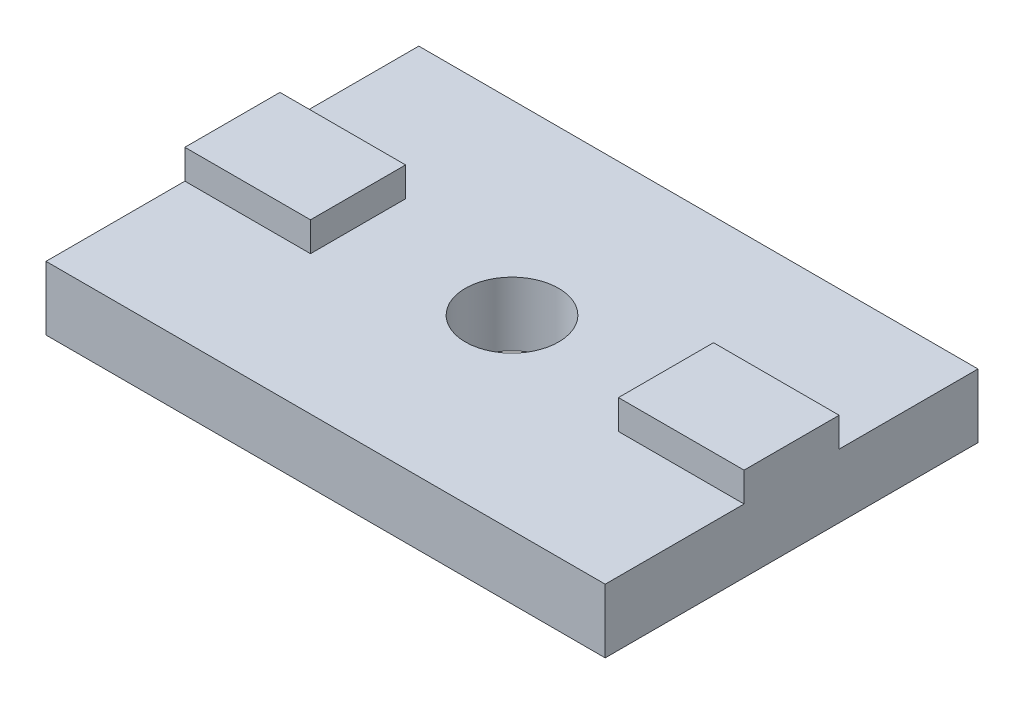
ISO-10303-21;
HEADER;
FILE_DESCRIPTION(('STEP AP214'),'2;1');
FILE_NAME('part.step','',(''),(''),'','','');
FILE_SCHEMA(('AUTOMOTIVE_DESIGN { 1 0 10303 214 1 1 1 1 }'));
ENDSEC;
DATA;
#1=APPLICATION_CONTEXT('core data for automotive mechanical design processes');
#2=APPLICATION_PROTOCOL_DEFINITION('international standard','automotive_design',2000,#1);
#3=PRODUCT_CONTEXT('',#1,'mechanical');
#4=PRODUCT('Part','Part','',(#3));
#5=PRODUCT_RELATED_PRODUCT_CATEGORY('part','',(#4));
#6=PRODUCT_DEFINITION_FORMATION('','',#4);
#7=PRODUCT_DEFINITION_CONTEXT('part definition',#1,'design');
#8=PRODUCT_DEFINITION('design','',#6,#7);
#9=PRODUCT_DEFINITION_SHAPE('','',#8);
#10=(LENGTH_UNIT() NAMED_UNIT(*) SI_UNIT(.MILLI.,.METRE.));
#11=(NAMED_UNIT(*) PLANE_ANGLE_UNIT() SI_UNIT($,.RADIAN.));
#12=(NAMED_UNIT(*) SI_UNIT($,.STERADIAN.) SOLID_ANGLE_UNIT());
#13=UNCERTAINTY_MEASURE_WITH_UNIT(LENGTH_MEASURE(1.E-05),#10,'distance_accuracy_value','');
#14=(GEOMETRIC_REPRESENTATION_CONTEXT(3) GLOBAL_UNCERTAINTY_ASSIGNED_CONTEXT((#13)) GLOBAL_UNIT_ASSIGNED_CONTEXT((#10,
#11,#12)) REPRESENTATION_CONTEXT('',''));
#15=CARTESIAN_POINT('',(0.,0.,0.));
#16=DIRECTION('',(0.,0.,1.));
#17=DIRECTION('',(1.,0.,0.));
#18=AXIS2_PLACEMENT_3D('',#15,#16,#17);
#19=CARTESIAN_POINT('',(0.,4.35,0.));
#20=DIRECTION('',(0.,-1.,0.));
#21=DIRECTION('',(0.,0.,-1.));
#22=AXIS2_PLACEMENT_3D('',#19,#20,#21);
#23=PLANE('',#22);
#24=CARTESIAN_POINT('',(16.1721162783775,4.35,-18.9316286390001));
#25=DIRECTION('',(0.,1.,0.));
#26=DIRECTION('',(0.,0.,1.));
#27=AXIS2_PLACEMENT_3D('',#24,#25,#26);
#28=CIRCLE('',#27,3.175);
#29=CARTESIAN_POINT('',(16.1721162783775,4.35,-15.7566286390001));
#30=VERTEX_POINT('',#29);
#31=EDGE_CURVE('E179',#30,#30,#28,.T.);
#32=ORIENTED_EDGE('',*,*,#31,.F.);
#33=EDGE_LOOP('',(#32));
#34=FACE_BOUND('',#33,.T.);
#35=DIRECTION('',(-1.,0.,0.));
#36=VECTOR('',#35,1.);
#37=CARTESIAN_POINT('',(26.6623162783775,4.35,-22.1700855208305));
#38=LINE('',#37,#36);
#39=CARTESIAN_POINT('',(35.2221162783775,4.35,-22.1700855208305));
#40=VERTEX_POINT('',#39);
#41=CARTESIAN_POINT('',(26.6623162783775,4.35,-22.1700855208305));
#42=VERTEX_POINT('',#41);
#43=EDGE_CURVE('E142',#40,#42,#38,.T.);
#44=ORIENTED_EDGE('',*,*,#43,.F.);
#45=DIRECTION('',(0.,0.,-1.));
#46=VECTOR('',#45,1.);
#47=CARTESIAN_POINT('',(35.2221162783775,4.35,-6.23162863900006));
#48=LINE('',#47,#46);
#49=CARTESIAN_POINT('',(35.2221162783775,4.35,-31.6316286390001));
#50=VERTEX_POINT('',#49);
#51=EDGE_CURVE('E190',#40,#50,#48,.T.);
#52=ORIENTED_EDGE('',*,*,#51,.T.);
#53=DIRECTION('',(-1.,0.,0.));
#54=VECTOR('',#53,1.);
#55=CARTESIAN_POINT('',(-2.87788372162251,4.35,-31.6316286390001));
#56=LINE('',#55,#54);
#57=CARTESIAN_POINT('',(-2.87788372162251,4.35,-31.6316286390001));
#58=VERTEX_POINT('',#57);
#59=EDGE_CURVE('E193',#50,#58,#56,.T.);
#60=ORIENTED_EDGE('',*,*,#59,.T.);
#61=DIRECTION('',(0.,0.,1.));
#62=VECTOR('',#61,1.);
#63=CARTESIAN_POINT('',(-2.87788372162251,4.35,-6.23162863900006));
#64=LINE('',#63,#62);
#65=CARTESIAN_POINT('',(-2.87788372162251,4.35,-22.1700855208305));
#66=VERTEX_POINT('',#65);
#67=EDGE_CURVE('E185',#58,#66,#64,.T.);
#68=ORIENTED_EDGE('',*,*,#67,.T.);
#69=DIRECTION('',(-1.,0.,0.));
#70=VECTOR('',#69,1.);
#71=CARTESIAN_POINT('',(5.6819162783775,4.35,-22.1700855208305));
#72=LINE('',#71,#70);
#73=CARTESIAN_POINT('',(5.6819162783775,4.35,-22.1700855208305));
#74=VERTEX_POINT('',#73);
#75=EDGE_CURVE('E146',#74,#66,#72,.T.);
#76=ORIENTED_EDGE('',*,*,#75,.F.);
#77=DIRECTION('',(0.,0.,-1.));
#78=VECTOR('',#77,1.);
#79=CARTESIAN_POINT('',(5.6819162783775,4.35,-22.1700855208305));
#80=LINE('',#79,#78);
#81=CARTESIAN_POINT('',(5.6819162783775,4.35,-15.6931717571696));
#82=VERTEX_POINT('',#81);
#83=EDGE_CURVE('E143',#82,#74,#80,.T.);
#84=ORIENTED_EDGE('',*,*,#83,.F.);
#85=DIRECTION('',(1.,0.,0.));
#86=VECTOR('',#85,1.);
#87=CARTESIAN_POINT('',(5.6819162783775,4.35,-15.6931717571696));
#88=LINE('',#87,#86);
#89=CARTESIAN_POINT('',(-2.87788372162251,4.35,-15.6931717571696));
#90=VERTEX_POINT('',#89);
#91=EDGE_CURVE('E156',#90,#82,#88,.T.);
#92=ORIENTED_EDGE('',*,*,#91,.F.);
#93=CARTESIAN_POINT('',(-2.87788372162251,4.35,-6.23162863900006));
#94=VERTEX_POINT('',#93);
#95=EDGE_CURVE('E188',#90,#94,#64,.T.);
#96=ORIENTED_EDGE('',*,*,#95,.T.);
#97=DIRECTION('',(1.,0.,0.));
#98=VECTOR('',#97,1.);
#99=CARTESIAN_POINT('',(-2.87788372162251,4.35,-6.23162863900006));
#100=LINE('',#99,#98);
#101=CARTESIAN_POINT('',(35.2221162783775,4.35,-6.23162863900006));
#102=VERTEX_POINT('',#101);
#103=EDGE_CURVE('E187',#94,#102,#100,.T.);
#104=ORIENTED_EDGE('',*,*,#103,.T.);
#105=CARTESIAN_POINT('',(35.2221162783775,4.35,-15.6931717571696));
#106=VERTEX_POINT('',#105);
#107=EDGE_CURVE('E191',#102,#106,#48,.T.);
#108=ORIENTED_EDGE('',*,*,#107,.T.);
#109=DIRECTION('',(1.,0.,0.));
#110=VECTOR('',#109,1.);
#111=CARTESIAN_POINT('',(26.6623162783775,4.35,-15.6931717571696));
#112=LINE('',#111,#110);
#113=CARTESIAN_POINT('',(26.6623162783775,4.35,-15.6931717571696));
#114=VERTEX_POINT('',#113);
#115=EDGE_CURVE('E53',#114,#106,#112,.T.);
#116=ORIENTED_EDGE('',*,*,#115,.F.);
#117=DIRECTION('',(0.,0.,1.));
#118=VECTOR('',#117,1.);
#119=CARTESIAN_POINT('',(26.6623162783775,4.35,-22.1700855208305));
#120=LINE('',#119,#118);
#121=EDGE_CURVE('E48',#42,#114,#120,.T.);
#122=ORIENTED_EDGE('',*,*,#121,.F.);
#123=EDGE_LOOP('',(#44,#52,#60,#68,#76,#84,#92,#96,#104,#108,#116,#122));
#124=FACE_BOUND('',#123,.T.);
#125=ADVANCED_FACE('F33',(#34,#124),#23,.F.);
#126=CARTESIAN_POINT('',(0.,0.,0.));
#127=DIRECTION('',(0.,-1.,0.));
#128=DIRECTION('',(0.,0.,-1.));
#129=AXIS2_PLACEMENT_3D('',#126,#127,#128);
#130=PLANE('',#129);
#131=DIRECTION('',(0.,0.,1.));
#132=VECTOR('',#131,1.);
#133=CARTESIAN_POINT('',(-2.87788372162251,0.,-6.23162863900006));
#134=LINE('',#133,#132);
#135=CARTESIAN_POINT('',(-2.87788372162251,0.,-31.6316286390001));
#136=VERTEX_POINT('',#135);
#137=CARTESIAN_POINT('',(-2.87788372162251,0.,-6.23162863900006));
#138=VERTEX_POINT('',#137);
#139=EDGE_CURVE('E182',#136,#138,#134,.T.);
#140=ORIENTED_EDGE('',*,*,#139,.F.);
#141=DIRECTION('',(-1.,0.,0.));
#142=VECTOR('',#141,1.);
#143=CARTESIAN_POINT('',(-2.87788372162251,0.,-31.6316286390001));
#144=LINE('',#143,#142);
#145=CARTESIAN_POINT('',(35.2221162783775,0.,-31.6316286390001));
#146=VERTEX_POINT('',#145);
#147=EDGE_CURVE('E202',#146,#136,#144,.T.);
#148=ORIENTED_EDGE('',*,*,#147,.F.);
#149=DIRECTION('',(0.,0.,-1.));
#150=VECTOR('',#149,1.);
#151=CARTESIAN_POINT('',(35.2221162783775,0.,-6.23162863900006));
#152=LINE('',#151,#150);
#153=CARTESIAN_POINT('',(35.2221162783775,0.,-6.23162863900006));
#154=VERTEX_POINT('',#153);
#155=EDGE_CURVE('E200',#154,#146,#152,.T.);
#156=ORIENTED_EDGE('',*,*,#155,.F.);
#157=DIRECTION('',(1.,0.,0.));
#158=VECTOR('',#157,1.);
#159=CARTESIAN_POINT('',(-2.87788372162251,0.,-6.23162863900006));
#160=LINE('',#159,#158);
#161=EDGE_CURVE('E198',#138,#154,#160,.T.);
#162=ORIENTED_EDGE('',*,*,#161,.F.);
#163=EDGE_LOOP('',(#140,#148,#156,#162));
#164=FACE_BOUND('',#163,.T.);
#165=CARTESIAN_POINT('',(16.1721162783775,0.,-18.9316286390001));
#166=DIRECTION('',(0.,1.,0.));
#167=DIRECTION('',(0.,0.,1.));
#168=AXIS2_PLACEMENT_3D('',#165,#166,#167);
#169=CIRCLE('',#168,3.175);
#170=CARTESIAN_POINT('',(16.1721162783775,0.,-15.7566286390001));
#171=VERTEX_POINT('',#170);
#172=EDGE_CURVE('E178',#171,#171,#169,.T.);
#173=ORIENTED_EDGE('',*,*,#172,.T.);
#174=EDGE_LOOP('',(#173));
#175=FACE_BOUND('',#174,.T.);
#176=ADVANCED_FACE('F221',(#164,#175),#130,.T.);
#177=CARTESIAN_POINT('',(-2.87788372162251,4.35,-6.23162863900006));
#178=DIRECTION('',(1.,0.,0.));
#179=DIRECTION('',(0.,0.,-1.));
#180=AXIS2_PLACEMENT_3D('',#177,#178,#179);
#181=PLANE('',#180);
#182=ORIENTED_EDGE('',*,*,#139,.T.);
#183=DIRECTION('',(0.,-1.,0.));
#184=VECTOR('',#183,1.);
#185=CARTESIAN_POINT('',(-2.87788372162251,4.35,-6.23162863900006));
#186=LINE('',#185,#184);
#187=EDGE_CURVE('E11',#94,#138,#186,.T.);
#188=ORIENTED_EDGE('',*,*,#187,.F.);
#189=ORIENTED_EDGE('',*,*,#95,.F.);
#190=DIRECTION('',(0.,-1.,0.));
#191=VECTOR('',#190,1.);
#192=CARTESIAN_POINT('',(-2.87788372162251,6.35,-15.6931717571696));
#193=LINE('',#192,#191);
#194=CARTESIAN_POINT('',(-2.87788372162251,6.35,-15.6931717571696));
#195=VERTEX_POINT('',#194);
#196=EDGE_CURVE('E169',#195,#90,#193,.T.);
#197=ORIENTED_EDGE('',*,*,#196,.F.);
#198=DIRECTION('',(0.,0.,1.));
#199=VECTOR('',#198,1.);
#200=CARTESIAN_POINT('',(-2.87788372162251,6.35,-22.1700855208305));
#201=LINE('',#200,#199);
#202=CARTESIAN_POINT('',(-2.87788372162251,6.35,-22.1700855208305));
#203=VERTEX_POINT('',#202);
#204=EDGE_CURVE('E158',#203,#195,#201,.T.);
#205=ORIENTED_EDGE('',*,*,#204,.F.);
#206=DIRECTION('',(0.,-1.,0.));
#207=VECTOR('',#206,1.);
#208=CARTESIAN_POINT('',(-2.87788372162251,6.35,-22.1700855208305));
#209=LINE('',#208,#207);
#210=EDGE_CURVE('E172',#203,#66,#209,.T.);
#211=ORIENTED_EDGE('',*,*,#210,.T.);
#212=ORIENTED_EDGE('',*,*,#67,.F.);
#213=DIRECTION('',(0.,-1.,0.));
#214=VECTOR('',#213,1.);
#215=CARTESIAN_POINT('',(-2.87788372162251,4.35,-31.6316286390001));
#216=LINE('',#215,#214);
#217=EDGE_CURVE('E195',#58,#136,#216,.T.);
#218=ORIENTED_EDGE('',*,*,#217,.T.);
#219=EDGE_LOOP('',(#182,#188,#189,#197,#205,#211,#212,#218));
#220=FACE_BOUND('',#219,.T.);
#221=ADVANCED_FACE('F35',(#220),#181,.F.);
#222=CARTESIAN_POINT('',(-2.87788372162251,4.35,-6.23162863900006));
#223=DIRECTION('',(0.,0.,-1.));
#224=DIRECTION('',(-1.,0.,0.));
#225=AXIS2_PLACEMENT_3D('',#222,#223,#224);
#226=PLANE('',#225);
#227=ORIENTED_EDGE('',*,*,#161,.T.);
#228=DIRECTION('',(0.,-1.,0.));
#229=VECTOR('',#228,1.);
#230=CARTESIAN_POINT('',(35.2221162783775,4.35,-6.23162863900006));
#231=LINE('',#230,#229);
#232=EDGE_CURVE('E41',#102,#154,#231,.T.);
#233=ORIENTED_EDGE('',*,*,#232,.F.);
#234=ORIENTED_EDGE('',*,*,#103,.F.);
#235=ORIENTED_EDGE('',*,*,#187,.T.);
#236=EDGE_LOOP('',(#227,#233,#234,#235));
#237=FACE_BOUND('',#236,.T.);
#238=ADVANCED_FACE('F244',(#237),#226,.F.);
#239=CARTESIAN_POINT('',(35.2221162783775,4.35,-6.23162863900006));
#240=DIRECTION('',(-1.,0.,0.));
#241=DIRECTION('',(0.,0.,1.));
#242=AXIS2_PLACEMENT_3D('',#239,#240,#241);
#243=PLANE('',#242);
#244=ORIENTED_EDGE('',*,*,#155,.T.);
#245=DIRECTION('',(0.,-1.,0.));
#246=VECTOR('',#245,1.);
#247=CARTESIAN_POINT('',(35.2221162783775,4.35,-31.6316286390001));
#248=LINE('',#247,#246);
#249=EDGE_CURVE('E206',#50,#146,#248,.T.);
#250=ORIENTED_EDGE('',*,*,#249,.F.);
#251=ORIENTED_EDGE('',*,*,#51,.F.);
#252=DIRECTION('',(0.,-1.,0.));
#253=VECTOR('',#252,1.);
#254=CARTESIAN_POINT('',(35.2221162783775,6.35,-22.1700855208305));
#255=LINE('',#254,#253);
#256=CARTESIAN_POINT('',(35.2221162783775,6.35,-22.1700855208305));
#257=VERTEX_POINT('',#256);
#258=EDGE_CURVE('E381',#257,#40,#255,.T.);
#259=ORIENTED_EDGE('',*,*,#258,.F.);
#260=DIRECTION('',(0.,0.,-1.));
#261=VECTOR('',#260,1.);
#262=CARTESIAN_POINT('',(35.2221162783775,6.35,-22.1700855208305));
#263=LINE('',#262,#261);
#264=CARTESIAN_POINT('',(35.2221162783775,6.35,-15.6931717571696));
#265=VERTEX_POINT('',#264);
#266=EDGE_CURVE('E136',#265,#257,#263,.T.);
#267=ORIENTED_EDGE('',*,*,#266,.F.);
#268=DIRECTION('',(0.,-1.,0.));
#269=VECTOR('',#268,1.);
#270=CARTESIAN_POINT('',(35.2221162783775,6.35,-15.6931717571696));
#271=LINE('',#270,#269);
#272=EDGE_CURVE('E148',#265,#106,#271,.T.);
#273=ORIENTED_EDGE('',*,*,#272,.T.);
#274=ORIENTED_EDGE('',*,*,#107,.F.);
#275=ORIENTED_EDGE('',*,*,#232,.T.);
#276=EDGE_LOOP('',(#244,#250,#251,#259,#267,#273,#274,#275));
#277=FACE_BOUND('',#276,.T.);
#278=ADVANCED_FACE('F213',(#277),#243,.F.);
#279=CARTESIAN_POINT('',(-2.87788372162251,4.35,-31.6316286390001));
#280=DIRECTION('',(0.,0.,1.));
#281=DIRECTION('',(1.,0.,0.));
#282=AXIS2_PLACEMENT_3D('',#279,#280,#281);
#283=PLANE('',#282);
#284=ORIENTED_EDGE('',*,*,#147,.T.);
#285=ORIENTED_EDGE('',*,*,#217,.F.);
#286=ORIENTED_EDGE('',*,*,#59,.F.);
#287=ORIENTED_EDGE('',*,*,#249,.T.);
#288=EDGE_LOOP('',(#284,#285,#286,#287));
#289=FACE_BOUND('',#288,.T.);
#290=ADVANCED_FACE('F225',(#289),#283,.F.);
#291=CARTESIAN_POINT('',(16.1721162783775,4.35,-18.9316286390001));
#292=DIRECTION('',(0.,-1.,0.));
#293=DIRECTION('',(0.,0.,-1.));
#294=AXIS2_PLACEMENT_3D('',#291,#292,#293);
#295=CYLINDRICAL_SURFACE('',#294,3.175);
#296=ORIENTED_EDGE('',*,*,#31,.T.);
#297=EDGE_LOOP('',(#296));
#298=FACE_BOUND('',#297,.T.);
#299=ORIENTED_EDGE('',*,*,#172,.F.);
#300=EDGE_LOOP('',(#299));
#301=FACE_BOUND('',#300,.T.);
#302=ADVANCED_FACE('F260',(#298,#301),#295,.F.);
#303=CARTESIAN_POINT('',(5.6819162783775,6.35,-22.1700855208305));
#304=DIRECTION('',(-1.,0.,0.));
#305=DIRECTION('',(0.,0.,1.));
#306=AXIS2_PLACEMENT_3D('',#303,#304,#305);
#307=PLANE('',#306);
#308=ORIENTED_EDGE('',*,*,#83,.T.);
#309=DIRECTION('',(0.,-1.,0.));
#310=VECTOR('',#309,1.);
#311=CARTESIAN_POINT('',(5.6819162783775,6.35,-22.1700855208305));
#312=LINE('',#311,#310);
#313=CARTESIAN_POINT('',(5.6819162783775,6.35,-22.1700855208305));
#314=VERTEX_POINT('',#313);
#315=EDGE_CURVE('E175',#314,#74,#312,.T.);
#316=ORIENTED_EDGE('',*,*,#315,.F.);
#317=DIRECTION('',(0.,0.,-1.));
#318=VECTOR('',#317,1.);
#319=CARTESIAN_POINT('',(5.6819162783775,6.35,-22.1700855208305));
#320=LINE('',#319,#318);
#321=CARTESIAN_POINT('',(5.6819162783775,6.35,-15.6931717571696));
#322=VERTEX_POINT('',#321);
#323=EDGE_CURVE('E152',#322,#314,#320,.T.);
#324=ORIENTED_EDGE('',*,*,#323,.F.);
#325=DIRECTION('',(0.,-1.,0.));
#326=VECTOR('',#325,1.);
#327=CARTESIAN_POINT('',(5.6819162783775,6.35,-15.6931717571696));
#328=LINE('',#327,#326);
#329=EDGE_CURVE('E161',#322,#82,#328,.T.);
#330=ORIENTED_EDGE('',*,*,#329,.T.);
#331=EDGE_LOOP('',(#308,#316,#324,#330));
#332=FACE_BOUND('',#331,.T.);
#333=ADVANCED_FACE('F237',(#332),#307,.F.);
#334=CARTESIAN_POINT('',(5.6819162783775,6.35,-22.1700855208305));
#335=DIRECTION('',(0.,0.,1.));
#336=DIRECTION('',(1.,0.,0.));
#337=AXIS2_PLACEMENT_3D('',#334,#335,#336);
#338=PLANE('',#337);
#339=ORIENTED_EDGE('',*,*,#75,.T.);
#340=ORIENTED_EDGE('',*,*,#210,.F.);
#341=DIRECTION('',(-1.,0.,0.));
#342=VECTOR('',#341,1.);
#343=CARTESIAN_POINT('',(5.6819162783775,6.35,-22.1700855208305));
#344=LINE('',#343,#342);
#345=EDGE_CURVE('E155',#314,#203,#344,.T.);
#346=ORIENTED_EDGE('',*,*,#345,.F.);
#347=ORIENTED_EDGE('',*,*,#315,.T.);
#348=EDGE_LOOP('',(#339,#340,#346,#347));
#349=FACE_BOUND('',#348,.T.);
#350=ADVANCED_FACE('F233',(#349),#338,.F.);
#351=CARTESIAN_POINT('',(5.6819162783775,6.35,-15.6931717571696));
#352=DIRECTION('',(0.,0.,-1.));
#353=DIRECTION('',(-1.,0.,0.));
#354=AXIS2_PLACEMENT_3D('',#351,#352,#353);
#355=PLANE('',#354);
#356=ORIENTED_EDGE('',*,*,#91,.T.);
#357=ORIENTED_EDGE('',*,*,#329,.F.);
#358=DIRECTION('',(1.,0.,0.));
#359=VECTOR('',#358,1.);
#360=CARTESIAN_POINT('',(5.6819162783775,6.35,-15.6931717571696));
#361=LINE('',#360,#359);
#362=EDGE_CURVE('E160',#195,#322,#361,.T.);
#363=ORIENTED_EDGE('',*,*,#362,.F.);
#364=ORIENTED_EDGE('',*,*,#196,.T.);
#365=EDGE_LOOP('',(#356,#357,#363,#364));
#366=FACE_BOUND('',#365,.T.);
#367=ADVANCED_FACE('F241',(#366),#355,.F.);
#368=CARTESIAN_POINT('',(0.,6.35,0.));
#369=DIRECTION('',(0.,-1.,0.));
#370=DIRECTION('',(0.,0.,-1.));
#371=AXIS2_PLACEMENT_3D('',#368,#369,#370);
#372=PLANE('',#371);
#373=ORIENTED_EDGE('',*,*,#323,.T.);
#374=ORIENTED_EDGE('',*,*,#345,.T.);
#375=ORIENTED_EDGE('',*,*,#204,.T.);
#376=ORIENTED_EDGE('',*,*,#362,.T.);
#377=EDGE_LOOP('',(#373,#374,#375,#376));
#378=FACE_BOUND('',#377,.T.);
#379=ADVANCED_FACE('F280',(#378),#372,.F.);
#380=CARTESIAN_POINT('',(26.6623162783775,6.35,-22.1700855208305));
#381=DIRECTION('',(0.,0.,1.));
#382=DIRECTION('',(1.,0.,0.));
#383=AXIS2_PLACEMENT_3D('',#380,#381,#382);
#384=PLANE('',#383);
#385=ORIENTED_EDGE('',*,*,#43,.T.);
#386=DIRECTION('',(0.,-1.,0.));
#387=VECTOR('',#386,1.);
#388=CARTESIAN_POINT('',(26.6623162783775,6.35,-22.1700855208305));
#389=LINE('',#388,#387);
#390=CARTESIAN_POINT('',(26.6623162783775,6.35,-22.1700855208305));
#391=VERTEX_POINT('',#390);
#392=EDGE_CURVE('E124',#391,#42,#389,.T.);
#393=ORIENTED_EDGE('',*,*,#392,.F.);
#394=DIRECTION('',(-1.,0.,0.));
#395=VECTOR('',#394,1.);
#396=CARTESIAN_POINT('',(26.6623162783775,6.35,-22.1700855208305));
#397=LINE('',#396,#395);
#398=EDGE_CURVE('E131',#257,#391,#397,.T.);
#399=ORIENTED_EDGE('',*,*,#398,.F.);
#400=ORIENTED_EDGE('',*,*,#258,.T.);
#401=EDGE_LOOP('',(#385,#393,#399,#400));
#402=FACE_BOUND('',#401,.T.);
#403=ADVANCED_FACE('F141',(#402),#384,.F.);
#404=CARTESIAN_POINT('',(26.6623162783775,6.35,-22.1700855208305));
#405=DIRECTION('',(1.,0.,0.));
#406=DIRECTION('',(0.,0.,-1.));
#407=AXIS2_PLACEMENT_3D('',#404,#405,#406);
#408=PLANE('',#407);
#409=ORIENTED_EDGE('',*,*,#121,.T.);
#410=DIRECTION('',(0.,-1.,0.));
#411=VECTOR('',#410,1.);
#412=CARTESIAN_POINT('',(26.6623162783775,6.35,-15.6931717571696));
#413=LINE('',#412,#411);
#414=CARTESIAN_POINT('',(26.6623162783775,6.35,-15.6931717571696));
#415=VERTEX_POINT('',#414);
#416=EDGE_CURVE('E127',#415,#114,#413,.T.);
#417=ORIENTED_EDGE('',*,*,#416,.F.);
#418=DIRECTION('',(0.,0.,1.));
#419=VECTOR('',#418,1.);
#420=CARTESIAN_POINT('',(26.6623162783775,6.35,-22.1700855208305));
#421=LINE('',#420,#419);
#422=EDGE_CURVE('E120',#391,#415,#421,.T.);
#423=ORIENTED_EDGE('',*,*,#422,.F.);
#424=ORIENTED_EDGE('',*,*,#392,.T.);
#425=EDGE_LOOP('',(#409,#417,#423,#424));
#426=FACE_BOUND('',#425,.T.);
#427=ADVANCED_FACE('F122',(#426),#408,.F.);
#428=CARTESIAN_POINT('',(26.6623162783775,6.35,-15.6931717571696));
#429=DIRECTION('',(0.,0.,-1.));
#430=DIRECTION('',(-1.,0.,0.));
#431=AXIS2_PLACEMENT_3D('',#428,#429,#430);
#432=PLANE('',#431);
#433=ORIENTED_EDGE('',*,*,#115,.T.);
#434=ORIENTED_EDGE('',*,*,#272,.F.);
#435=DIRECTION('',(1.,0.,0.));
#436=VECTOR('',#435,1.);
#437=CARTESIAN_POINT('',(26.6623162783775,6.35,-15.6931717571696));
#438=LINE('',#437,#436);
#439=EDGE_CURVE('E130',#415,#265,#438,.T.);
#440=ORIENTED_EDGE('',*,*,#439,.F.);
#441=ORIENTED_EDGE('',*,*,#416,.T.);
#442=EDGE_LOOP('',(#433,#434,#440,#441));
#443=FACE_BOUND('',#442,.T.);
#444=ADVANCED_FACE('F288',(#443),#432,.F.);
#445=CARTESIAN_POINT('',(0.,6.35,0.));
#446=DIRECTION('',(0.,-1.,0.));
#447=DIRECTION('',(0.,0.,-1.));
#448=AXIS2_PLACEMENT_3D('',#445,#446,#447);
#449=PLANE('',#448);
#450=ORIENTED_EDGE('',*,*,#398,.T.);
#451=ORIENTED_EDGE('',*,*,#422,.T.);
#452=ORIENTED_EDGE('',*,*,#439,.T.);
#453=ORIENTED_EDGE('',*,*,#266,.T.);
#454=EDGE_LOOP('',(#450,#451,#452,#453));
#455=FACE_BOUND('',#454,.T.);
#456=ADVANCED_FACE('F134',(#455),#449,.F.);
#457=CLOSED_SHELL('',(#125,#176,#221,#238,#278,#290,#302,#333,#350,#367,#379,#403,#427,#444,#456));
#458=MANIFOLD_SOLID_BREP('B2',#457);
#459=ADVANCED_BREP_SHAPE_REPRESENTATION('',(#18,#458),#14);
#460=SHAPE_DEFINITION_REPRESENTATION(#9,#459);
ENDSEC;
END-ISO-10303-21;
